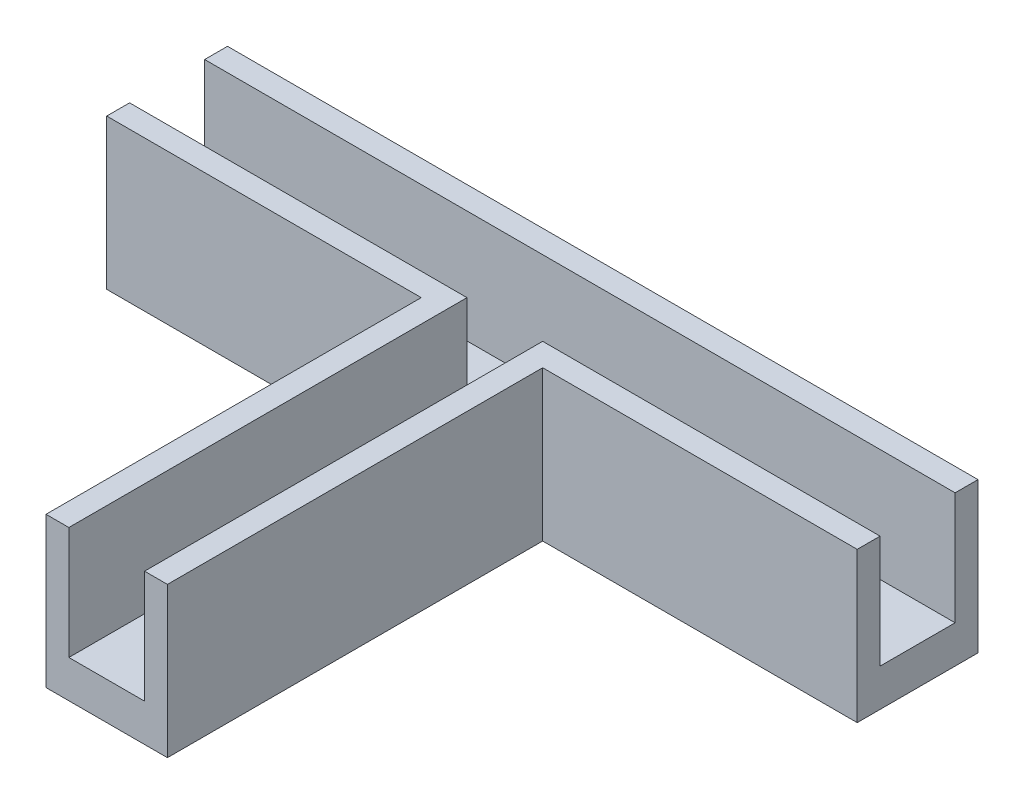
ISO-10303-21;
HEADER;
FILE_DESCRIPTION(('STEP AP214'),'2;1');
FILE_NAME('part.step','',(''),(''),'','','');
FILE_SCHEMA(('AUTOMOTIVE_DESIGN { 1 0 10303 214 1 1 1 1 }'));
ENDSEC;
DATA;
#1=APPLICATION_CONTEXT('core data for automotive mechanical design processes');
#2=APPLICATION_PROTOCOL_DEFINITION('international standard','automotive_design',2000,#1);
#3=PRODUCT_CONTEXT('',#1,'mechanical');
#4=PRODUCT('Part','Part','',(#3));
#5=PRODUCT_RELATED_PRODUCT_CATEGORY('part','',(#4));
#6=PRODUCT_DEFINITION_FORMATION('','',#4);
#7=PRODUCT_DEFINITION_CONTEXT('part definition',#1,'design');
#8=PRODUCT_DEFINITION('design','',#6,#7);
#9=PRODUCT_DEFINITION_SHAPE('','',#8);
#10=(LENGTH_UNIT() NAMED_UNIT(*) SI_UNIT(.MILLI.,.METRE.));
#11=(NAMED_UNIT(*) PLANE_ANGLE_UNIT() SI_UNIT($,.RADIAN.));
#12=(NAMED_UNIT(*) SI_UNIT($,.STERADIAN.) SOLID_ANGLE_UNIT());
#13=UNCERTAINTY_MEASURE_WITH_UNIT(LENGTH_MEASURE(1.E-05),#10,'distance_accuracy_value','');
#14=(GEOMETRIC_REPRESENTATION_CONTEXT(3) GLOBAL_UNCERTAINTY_ASSIGNED_CONTEXT((#13)) GLOBAL_UNIT_ASSIGNED_CONTEXT((#10,
#11,#12)) REPRESENTATION_CONTEXT('',''));
#15=CARTESIAN_POINT('',(0.,0.,0.));
#16=DIRECTION('',(0.,0.,1.));
#17=DIRECTION('',(1.,0.,0.));
#18=AXIS2_PLACEMENT_3D('',#15,#16,#17);
#19=CARTESIAN_POINT('',(0.,2.5,29.023999953));
#20=DIRECTION('',(0.,0.,-1.));
#21=DIRECTION('',(-1.,0.,0.));
#22=AXIS2_PLACEMENT_3D('',#19,#20,#21);
#23=PLANE('',#22);
#24=DIRECTION('',(1.,0.,0.));
#25=VECTOR('',#24,1.);
#26=CARTESIAN_POINT('',(0.,0.,29.023999953));
#27=LINE('',#26,#25);
#28=CARTESIAN_POINT('',(-4.04500000000002,0.,29.023999953));
#29=VERTEX_POINT('',#28);
#30=CARTESIAN_POINT('',(4.04499999999998,0.,29.023999953));
#31=VERTEX_POINT('',#30);
#32=EDGE_CURVE('E50',#29,#31,#27,.T.);
#33=ORIENTED_EDGE('',*,*,#32,.T.);
#34=DIRECTION('',(0.,-1.,0.));
#35=VECTOR('',#34,1.);
#36=CARTESIAN_POINT('',(4.04499999999998,10.,29.023999953));
#37=LINE('',#36,#35);
#38=CARTESIAN_POINT('',(4.04499999999998,10.,29.023999953));
#39=VERTEX_POINT('',#38);
#40=EDGE_CURVE('E261',#39,#31,#37,.T.);
#41=ORIENTED_EDGE('',*,*,#40,.F.);
#42=DIRECTION('',(1.,0.,0.));
#43=VECTOR('',#42,1.);
#44=CARTESIAN_POINT('',(0.,10.,29.023999953));
#45=LINE('',#44,#43);
#46=CARTESIAN_POINT('',(2.52099999999998,10.,29.023999953));
#47=VERTEX_POINT('',#46);
#48=EDGE_CURVE('E230',#47,#39,#45,.T.);
#49=ORIENTED_EDGE('',*,*,#48,.F.);
#50=DIRECTION('',(0.,-1.,0.));
#51=VECTOR('',#50,1.);
#52=CARTESIAN_POINT('',(2.52099999999998,10.,29.023999953));
#53=LINE('',#52,#51);
#54=CARTESIAN_POINT('',(2.52099999999998,2.5,29.023999953));
#55=VERTEX_POINT('',#54);
#56=EDGE_CURVE('E265',#47,#55,#53,.T.);
#57=ORIENTED_EDGE('',*,*,#56,.T.);
#58=DIRECTION('',(1.,0.,0.));
#59=VECTOR('',#58,1.);
#60=CARTESIAN_POINT('',(0.,2.5,29.023999953));
#61=LINE('',#60,#59);
#62=CARTESIAN_POINT('',(-2.52100000000002,2.5,29.023999953));
#63=VERTEX_POINT('',#62);
#64=EDGE_CURVE('E56',#63,#55,#61,.T.);
#65=ORIENTED_EDGE('',*,*,#64,.F.);
#66=DIRECTION('',(0.,-1.,0.));
#67=VECTOR('',#66,1.);
#68=CARTESIAN_POINT('',(-2.52100000000002,10.,29.023999953));
#69=LINE('',#68,#67);
#70=CARTESIAN_POINT('',(-2.52100000000002,10.,29.023999953));
#71=VERTEX_POINT('',#70);
#72=EDGE_CURVE('E199',#71,#63,#69,.T.);
#73=ORIENTED_EDGE('',*,*,#72,.F.);
#74=DIRECTION('',(-1.,0.,0.));
#75=VECTOR('',#74,1.);
#76=CARTESIAN_POINT('',(0.,10.,29.023999953));
#77=LINE('',#76,#75);
#78=CARTESIAN_POINT('',(-4.04500000000002,10.,29.023999953));
#79=VERTEX_POINT('',#78);
#80=EDGE_CURVE('E178',#71,#79,#77,.T.);
#81=ORIENTED_EDGE('',*,*,#80,.T.);
#82=DIRECTION('',(0.,-1.,0.));
#83=VECTOR('',#82,1.);
#84=CARTESIAN_POINT('',(-4.04500000000002,10.,29.023999953));
#85=LINE('',#84,#83);
#86=EDGE_CURVE('E208',#79,#29,#85,.T.);
#87=ORIENTED_EDGE('',*,*,#86,.T.);
#88=EDGE_LOOP('',(#33,#41,#49,#57,#65,#73,#81,#87));
#89=FACE_BOUND('',#88,.T.);
#90=ADVANCED_FACE('F47',(#89),#23,.F.);
#91=CARTESIAN_POINT('',(0.,2.5,0.));
#92=DIRECTION('',(0.,1.,0.));
#93=DIRECTION('',(0.,0.,1.));
#94=AXIS2_PLACEMENT_3D('',#91,#92,#93);
#95=PLANE('',#94);
#96=DIRECTION('',(0.,0.,1.));
#97=VECTOR('',#96,1.);
#98=CARTESIAN_POINT('',(-2.52100000000002,2.5,0.));
#99=LINE('',#98,#97);
#100=CARTESIAN_POINT('',(-2.52100000000002,2.5,2.499999953));
#101=VERTEX_POINT('',#100);
#102=EDGE_CURVE('E166',#101,#63,#99,.T.);
#103=ORIENTED_EDGE('',*,*,#102,.T.);
#104=ORIENTED_EDGE('',*,*,#64,.T.);
#105=DIRECTION('',(0.,0.,1.));
#106=VECTOR('',#105,1.);
#107=CARTESIAN_POINT('',(2.52099999999999,2.5,0.));
#108=LINE('',#107,#106);
#109=CARTESIAN_POINT('',(2.52099999999999,2.5,2.499999953));
#110=VERTEX_POINT('',#109);
#111=EDGE_CURVE('E11',#110,#55,#108,.T.);
#112=ORIENTED_EDGE('',*,*,#111,.F.);
#113=DIRECTION('',(1.,0.,0.));
#114=VECTOR('',#113,1.);
#115=CARTESIAN_POINT('',(0.,2.5,2.499999953));
#116=LINE('',#115,#114);
#117=CARTESIAN_POINT('',(25.,2.5,2.499999953));
#118=VERTEX_POINT('',#117);
#119=EDGE_CURVE('E320',#110,#118,#116,.T.);
#120=ORIENTED_EDGE('',*,*,#119,.T.);
#121=DIRECTION('',(0.,0.,1.));
#122=VECTOR('',#121,1.);
#123=CARTESIAN_POINT('',(25.,2.5,0.));
#124=LINE('',#123,#122);
#125=CARTESIAN_POINT('',(25.,2.5,-2.499999953));
#126=VERTEX_POINT('',#125);
#127=EDGE_CURVE('E308',#126,#118,#124,.T.);
#128=ORIENTED_EDGE('',*,*,#127,.F.);
#129=DIRECTION('',(1.,0.,0.));
#130=VECTOR('',#129,1.);
#131=CARTESIAN_POINT('',(0.,2.5,-2.499999953));
#132=LINE('',#131,#130);
#133=CARTESIAN_POINT('',(-25.,2.5,-2.499999953));
#134=VERTEX_POINT('',#133);
#135=EDGE_CURVE('E312',#134,#126,#132,.T.);
#136=ORIENTED_EDGE('',*,*,#135,.F.);
#137=DIRECTION('',(0.,0.,1.));
#138=VECTOR('',#137,1.);
#139=CARTESIAN_POINT('',(-25.,2.5,0.));
#140=LINE('',#139,#138);
#141=CARTESIAN_POINT('',(-25.,2.5,2.499999953));
#142=VERTEX_POINT('',#141);
#143=EDGE_CURVE('E317',#134,#142,#140,.T.);
#144=ORIENTED_EDGE('',*,*,#143,.T.);
#145=EDGE_CURVE('E63',#142,#101,#116,.T.);
#146=ORIENTED_EDGE('',*,*,#145,.T.);
#147=EDGE_LOOP('',(#103,#104,#112,#120,#128,#136,#144,#146));
#148=FACE_BOUND('',#147,.T.);
#149=ADVANCED_FACE('F331',(#148),#95,.T.);
#150=CARTESIAN_POINT('',(0.,0.,0.));
#151=DIRECTION('',(0.,1.,0.));
#152=DIRECTION('',(0.,0.,1.));
#153=AXIS2_PLACEMENT_3D('',#150,#151,#152);
#154=PLANE('',#153);
#155=ORIENTED_EDGE('',*,*,#32,.F.);
#156=DIRECTION('',(0.,0.,1.));
#157=VECTOR('',#156,1.);
#158=CARTESIAN_POINT('',(-4.04500000000002,0.,0.));
#159=LINE('',#158,#157);
#160=CARTESIAN_POINT('',(-4.04500000000002,0.,4.02399995300001));
#161=VERTEX_POINT('',#160);
#162=EDGE_CURVE('E180',#161,#29,#159,.T.);
#163=ORIENTED_EDGE('',*,*,#162,.F.);
#164=DIRECTION('',(1.,0.,0.));
#165=VECTOR('',#164,1.);
#166=CARTESIAN_POINT('',(0.,0.,4.02399995300001));
#167=LINE('',#166,#165);
#168=CARTESIAN_POINT('',(-25.,0.,4.02399995300001));
#169=VERTEX_POINT('',#168);
#170=EDGE_CURVE('E200',#169,#161,#167,.T.);
#171=ORIENTED_EDGE('',*,*,#170,.F.);
#172=DIRECTION('',(0.,0.,1.));
#173=VECTOR('',#172,1.);
#174=CARTESIAN_POINT('',(-25.,0.,0.));
#175=LINE('',#174,#173);
#176=CARTESIAN_POINT('',(-25.,0.,-4.023999953));
#177=VERTEX_POINT('',#176);
#178=EDGE_CURVE('E313',#177,#169,#175,.T.);
#179=ORIENTED_EDGE('',*,*,#178,.F.);
#180=DIRECTION('',(1.,0.,0.));
#181=VECTOR('',#180,1.);
#182=CARTESIAN_POINT('',(0.,0.,-4.023999953));
#183=LINE('',#182,#181);
#184=CARTESIAN_POINT('',(25.,0.,-4.023999953));
#185=VERTEX_POINT('',#184);
#186=EDGE_CURVE('E272',#177,#185,#183,.T.);
#187=ORIENTED_EDGE('',*,*,#186,.T.);
#188=DIRECTION('',(0.,0.,1.));
#189=VECTOR('',#188,1.);
#190=CARTESIAN_POINT('',(25.,0.,0.));
#191=LINE('',#190,#189);
#192=CARTESIAN_POINT('',(25.,0.,4.023999953));
#193=VERTEX_POINT('',#192);
#194=EDGE_CURVE('E307',#185,#193,#191,.T.);
#195=ORIENTED_EDGE('',*,*,#194,.T.);
#196=DIRECTION('',(-1.,0.,0.));
#197=VECTOR('',#196,1.);
#198=CARTESIAN_POINT('',(0.,0.,4.02399995300001));
#199=LINE('',#198,#197);
#200=CARTESIAN_POINT('',(4.04499999999998,0.,4.02399995300001));
#201=VERTEX_POINT('',#200);
#202=EDGE_CURVE('E227',#193,#201,#199,.T.);
#203=ORIENTED_EDGE('',*,*,#202,.T.);
#204=DIRECTION('',(0.,0.,1.));
#205=VECTOR('',#204,1.);
#206=CARTESIAN_POINT('',(4.04499999999998,0.,0.));
#207=LINE('',#206,#205);
#208=EDGE_CURVE('E170',#201,#31,#207,.T.);
#209=ORIENTED_EDGE('',*,*,#208,.T.);
#210=EDGE_LOOP('',(#155,#163,#171,#179,#187,#195,#203,#209));
#211=FACE_BOUND('',#210,.T.);
#212=ADVANCED_FACE('F342',(#211),#154,.F.);
#213=CARTESIAN_POINT('',(25.,2.5,0.));
#214=DIRECTION('',(1.,0.,0.));
#215=DIRECTION('',(0.,0.,-1.));
#216=AXIS2_PLACEMENT_3D('',#213,#214,#215);
#217=PLANE('',#216);
#218=ORIENTED_EDGE('',*,*,#194,.F.);
#219=DIRECTION('',(0.,-1.,0.));
#220=VECTOR('',#219,1.);
#221=CARTESIAN_POINT('',(25.,10.,-4.023999953));
#222=LINE('',#221,#220);
#223=CARTESIAN_POINT('',(25.,10.,-4.023999953));
#224=VERTEX_POINT('',#223);
#225=EDGE_CURVE('E299',#224,#185,#222,.T.);
#226=ORIENTED_EDGE('',*,*,#225,.F.);
#227=DIRECTION('',(0.,0.,-1.));
#228=VECTOR('',#227,1.);
#229=CARTESIAN_POINT('',(25.,10.,-1.13826999736011E-13));
#230=LINE('',#229,#228);
#231=CARTESIAN_POINT('',(25.,10.,-2.499999953));
#232=VERTEX_POINT('',#231);
#233=EDGE_CURVE('E277',#232,#224,#230,.T.);
#234=ORIENTED_EDGE('',*,*,#233,.F.);
#235=DIRECTION('',(0.,-1.,0.));
#236=VECTOR('',#235,1.);
#237=CARTESIAN_POINT('',(25.,10.,-2.499999953));
#238=LINE('',#237,#236);
#239=EDGE_CURVE('E303',#232,#126,#238,.T.);
#240=ORIENTED_EDGE('',*,*,#239,.T.);
#241=ORIENTED_EDGE('',*,*,#127,.T.);
#242=DIRECTION('',(0.,-1.,0.));
#243=VECTOR('',#242,1.);
#244=CARTESIAN_POINT('',(25.,10.,2.499999953));
#245=LINE('',#244,#243);
#246=CARTESIAN_POINT('',(25.,10.,2.499999953));
#247=VERTEX_POINT('',#246);
#248=EDGE_CURVE('E245',#247,#118,#245,.T.);
#249=ORIENTED_EDGE('',*,*,#248,.F.);
#250=DIRECTION('',(0.,0.,1.));
#251=VECTOR('',#250,1.);
#252=CARTESIAN_POINT('',(25.,10.,1.13826999736011E-13));
#253=LINE('',#252,#251);
#254=CARTESIAN_POINT('',(25.,10.,4.023999953));
#255=VERTEX_POINT('',#254);
#256=EDGE_CURVE('E241',#247,#255,#253,.T.);
#257=ORIENTED_EDGE('',*,*,#256,.T.);
#258=DIRECTION('',(0.,-1.,0.));
#259=VECTOR('',#258,1.);
#260=CARTESIAN_POINT('',(25.,10.,4.023999953));
#261=LINE('',#260,#259);
#262=EDGE_CURVE('E254',#255,#193,#261,.T.);
#263=ORIENTED_EDGE('',*,*,#262,.T.);
#264=EDGE_LOOP('',(#218,#226,#234,#240,#241,#249,#257,#263));
#265=FACE_BOUND('',#264,.T.);
#266=ADVANCED_FACE('F349',(#265),#217,.T.);
#267=CARTESIAN_POINT('',(-25.,2.5,0.));
#268=DIRECTION('',(1.,0.,0.));
#269=DIRECTION('',(0.,0.,-1.));
#270=AXIS2_PLACEMENT_3D('',#267,#268,#269);
#271=PLANE('',#270);
#272=ORIENTED_EDGE('',*,*,#178,.T.);
#273=DIRECTION('',(0.,-1.,0.));
#274=VECTOR('',#273,1.);
#275=CARTESIAN_POINT('',(-25.,10.,4.02399995300001));
#276=LINE('',#275,#274);
#277=CARTESIAN_POINT('',(-25.,10.,4.02399995300001));
#278=VERTEX_POINT('',#277);
#279=EDGE_CURVE('E216',#278,#169,#276,.T.);
#280=ORIENTED_EDGE('',*,*,#279,.F.);
#281=DIRECTION('',(0.,0.,1.));
#282=VECTOR('',#281,1.);
#283=CARTESIAN_POINT('',(-25.,10.,-1.13826999736011E-13));
#284=LINE('',#283,#282);
#285=CARTESIAN_POINT('',(-25.,10.,2.499999953));
#286=VERTEX_POINT('',#285);
#287=EDGE_CURVE('E186',#286,#278,#284,.T.);
#288=ORIENTED_EDGE('',*,*,#287,.F.);
#289=DIRECTION('',(0.,-1.,0.));
#290=VECTOR('',#289,1.);
#291=CARTESIAN_POINT('',(-25.,10.,2.499999953));
#292=LINE('',#291,#290);
#293=EDGE_CURVE('E171',#286,#142,#292,.T.);
#294=ORIENTED_EDGE('',*,*,#293,.T.);
#295=ORIENTED_EDGE('',*,*,#143,.F.);
#296=DIRECTION('',(0.,-1.,0.));
#297=VECTOR('',#296,1.);
#298=CARTESIAN_POINT('',(-25.,10.,-2.499999953));
#299=LINE('',#298,#297);
#300=CARTESIAN_POINT('',(-25.,10.,-2.499999953));
#301=VERTEX_POINT('',#300);
#302=EDGE_CURVE('E288',#301,#134,#299,.T.);
#303=ORIENTED_EDGE('',*,*,#302,.F.);
#304=DIRECTION('',(0.,0.,-1.));
#305=VECTOR('',#304,1.);
#306=CARTESIAN_POINT('',(-25.,10.,1.13826999736011E-13));
#307=LINE('',#306,#305);
#308=CARTESIAN_POINT('',(-25.,10.,-4.023999953));
#309=VERTEX_POINT('',#308);
#310=EDGE_CURVE('E284',#301,#309,#307,.T.);
#311=ORIENTED_EDGE('',*,*,#310,.T.);
#312=DIRECTION('',(0.,-1.,0.));
#313=VECTOR('',#312,1.);
#314=CARTESIAN_POINT('',(-25.,10.,-4.023999953));
#315=LINE('',#314,#313);
#316=EDGE_CURVE('E295',#309,#177,#315,.T.);
#317=ORIENTED_EDGE('',*,*,#316,.T.);
#318=EDGE_LOOP('',(#272,#280,#288,#294,#295,#303,#311,#317));
#319=FACE_BOUND('',#318,.T.);
#320=ADVANCED_FACE('F357',(#319),#271,.F.);
#321=CARTESIAN_POINT('',(0.,10.,-2.499999953));
#322=DIRECTION('',(0.,0.,-1.));
#323=DIRECTION('',(-1.,0.,0.));
#324=AXIS2_PLACEMENT_3D('',#321,#322,#323);
#325=PLANE('',#324);
#326=ORIENTED_EDGE('',*,*,#302,.T.);
#327=ORIENTED_EDGE('',*,*,#135,.T.);
#328=ORIENTED_EDGE('',*,*,#239,.F.);
#329=DIRECTION('',(1.,0.,0.));
#330=VECTOR('',#329,1.);
#331=CARTESIAN_POINT('',(0.,10.,-2.499999953));
#332=LINE('',#331,#330);
#333=EDGE_CURVE('E273',#301,#232,#332,.T.);
#334=ORIENTED_EDGE('',*,*,#333,.F.);
#335=EDGE_LOOP('',(#326,#327,#328,#334));
#336=FACE_BOUND('',#335,.T.);
#337=ADVANCED_FACE('F354',(#336),#325,.F.);
#338=CARTESIAN_POINT('',(0.,10.,-4.023999953));
#339=DIRECTION('',(0.,0.,-1.));
#340=DIRECTION('',(-1.,0.,0.));
#341=AXIS2_PLACEMENT_3D('',#338,#339,#340);
#342=PLANE('',#341);
#343=ORIENTED_EDGE('',*,*,#186,.F.);
#344=ORIENTED_EDGE('',*,*,#316,.F.);
#345=DIRECTION('',(1.,0.,0.));
#346=VECTOR('',#345,1.);
#347=CARTESIAN_POINT('',(0.,10.,-4.023999953));
#348=LINE('',#347,#346);
#349=EDGE_CURVE('E280',#309,#224,#348,.T.);
#350=ORIENTED_EDGE('',*,*,#349,.T.);
#351=ORIENTED_EDGE('',*,*,#225,.T.);
#352=EDGE_LOOP('',(#343,#344,#350,#351));
#353=FACE_BOUND('',#352,.T.);
#354=ADVANCED_FACE('F385',(#353),#342,.T.);
#355=CARTESIAN_POINT('',(0.,10.,0.));
#356=DIRECTION('',(0.,1.,0.));
#357=DIRECTION('',(0.,0.,1.));
#358=AXIS2_PLACEMENT_3D('',#355,#356,#357);
#359=PLANE('',#358);
#360=ORIENTED_EDGE('',*,*,#333,.T.);
#361=ORIENTED_EDGE('',*,*,#233,.T.);
#362=ORIENTED_EDGE('',*,*,#349,.F.);
#363=ORIENTED_EDGE('',*,*,#310,.F.);
#364=EDGE_LOOP('',(#360,#361,#362,#363));
#365=FACE_BOUND('',#364,.T.);
#366=ADVANCED_FACE('F388',(#365),#359,.T.);
#367=CARTESIAN_POINT('',(0.,10.,2.499999953));
#368=DIRECTION('',(0.,0.,-1.));
#369=DIRECTION('',(-1.,0.,0.));
#370=AXIS2_PLACEMENT_3D('',#367,#368,#369);
#371=PLANE('',#370);
#372=ORIENTED_EDGE('',*,*,#248,.T.);
#373=ORIENTED_EDGE('',*,*,#119,.F.);
#374=DIRECTION('',(0.,-1.,0.));
#375=VECTOR('',#374,1.);
#376=CARTESIAN_POINT('',(2.52099999999999,10.,2.499999953));
#377=LINE('',#376,#375);
#378=CARTESIAN_POINT('',(2.52099999999999,10.,2.499999953));
#379=VERTEX_POINT('',#378);
#380=EDGE_CURVE('E268',#379,#110,#377,.T.);
#381=ORIENTED_EDGE('',*,*,#380,.F.);
#382=DIRECTION('',(1.,0.,0.));
#383=VECTOR('',#382,1.);
#384=CARTESIAN_POINT('',(0.,10.,2.499999953));
#385=LINE('',#384,#383);
#386=EDGE_CURVE('E222',#379,#247,#385,.T.);
#387=ORIENTED_EDGE('',*,*,#386,.T.);
#388=EDGE_LOOP('',(#372,#373,#381,#387));
#389=FACE_BOUND('',#388,.T.);
#390=ADVANCED_FACE('F392',(#389),#371,.T.);
#391=CARTESIAN_POINT('',(2.52099999999999,10.,0.));
#392=DIRECTION('',(1.,0.,0.));
#393=DIRECTION('',(0.,0.,-1.));
#394=AXIS2_PLACEMENT_3D('',#391,#392,#393);
#395=PLANE('',#394);
#396=ORIENTED_EDGE('',*,*,#111,.T.);
#397=ORIENTED_EDGE('',*,*,#56,.F.);
#398=DIRECTION('',(0.,0.,1.));
#399=VECTOR('',#398,1.);
#400=CARTESIAN_POINT('',(2.52099999999999,10.,0.));
#401=LINE('',#400,#399);
#402=EDGE_CURVE('E226',#379,#47,#401,.T.);
#403=ORIENTED_EDGE('',*,*,#402,.F.);
#404=ORIENTED_EDGE('',*,*,#380,.T.);
#405=EDGE_LOOP('',(#396,#397,#403,#404));
#406=FACE_BOUND('',#405,.T.);
#407=ADVANCED_FACE('F396',(#406),#395,.F.);
#408=CARTESIAN_POINT('',(4.04499999999998,10.,0.));
#409=DIRECTION('',(1.,0.,0.));
#410=DIRECTION('',(0.,0.,-1.));
#411=AXIS2_PLACEMENT_3D('',#408,#409,#410);
#412=PLANE('',#411);
#413=ORIENTED_EDGE('',*,*,#208,.F.);
#414=DIRECTION('',(0.,-1.,0.));
#415=VECTOR('',#414,1.);
#416=CARTESIAN_POINT('',(4.04499999999998,10.,4.02399995300001));
#417=LINE('',#416,#415);
#418=CARTESIAN_POINT('',(4.04499999999998,10.,4.02399995300001));
#419=VERTEX_POINT('',#418);
#420=EDGE_CURVE('E258',#419,#201,#417,.T.);
#421=ORIENTED_EDGE('',*,*,#420,.F.);
#422=DIRECTION('',(0.,0.,1.));
#423=VECTOR('',#422,1.);
#424=CARTESIAN_POINT('',(4.04499999999998,10.,0.));
#425=LINE('',#424,#423);
#426=EDGE_CURVE('E233',#419,#39,#425,.T.);
#427=ORIENTED_EDGE('',*,*,#426,.T.);
#428=ORIENTED_EDGE('',*,*,#40,.T.);
#429=EDGE_LOOP('',(#413,#421,#427,#428));
#430=FACE_BOUND('',#429,.T.);
#431=ADVANCED_FACE('F399',(#430),#412,.T.);
#432=CARTESIAN_POINT('',(0.,10.,4.02399995300001));
#433=DIRECTION('',(0.,0.,1.));
#434=DIRECTION('',(1.,0.,0.));
#435=AXIS2_PLACEMENT_3D('',#432,#433,#434);
#436=PLANE('',#435);
#437=ORIENTED_EDGE('',*,*,#202,.F.);
#438=ORIENTED_EDGE('',*,*,#262,.F.);
#439=DIRECTION('',(-1.,0.,0.));
#440=VECTOR('',#439,1.);
#441=CARTESIAN_POINT('',(0.,10.,4.02399995300001));
#442=LINE('',#441,#440);
#443=EDGE_CURVE('E237',#255,#419,#442,.T.);
#444=ORIENTED_EDGE('',*,*,#443,.T.);
#445=ORIENTED_EDGE('',*,*,#420,.T.);
#446=EDGE_LOOP('',(#437,#438,#444,#445));
#447=FACE_BOUND('',#446,.T.);
#448=ADVANCED_FACE('F403',(#447),#436,.T.);
#449=CARTESIAN_POINT('',(0.,10.,0.));
#450=DIRECTION('',(0.,1.,0.));
#451=DIRECTION('',(0.,0.,1.));
#452=AXIS2_PLACEMENT_3D('',#449,#450,#451);
#453=PLANE('',#452);
#454=ORIENTED_EDGE('',*,*,#386,.F.);
#455=ORIENTED_EDGE('',*,*,#402,.T.);
#456=ORIENTED_EDGE('',*,*,#48,.T.);
#457=ORIENTED_EDGE('',*,*,#426,.F.);
#458=ORIENTED_EDGE('',*,*,#443,.F.);
#459=ORIENTED_EDGE('',*,*,#256,.F.);
#460=EDGE_LOOP('',(#454,#455,#456,#457,#458,#459));
#461=FACE_BOUND('',#460,.T.);
#462=ADVANCED_FACE('F407',(#461),#453,.T.);
#463=CARTESIAN_POINT('',(-2.52100000000002,10.,0.));
#464=DIRECTION('',(1.,0.,0.));
#465=DIRECTION('',(0.,0.,-1.));
#466=AXIS2_PLACEMENT_3D('',#463,#464,#465);
#467=PLANE('',#466);
#468=ORIENTED_EDGE('',*,*,#72,.T.);
#469=ORIENTED_EDGE('',*,*,#102,.F.);
#470=DIRECTION('',(0.,-1.,0.));
#471=VECTOR('',#470,1.);
#472=CARTESIAN_POINT('',(-2.52100000000002,10.,2.499999953));
#473=LINE('',#472,#471);
#474=CARTESIAN_POINT('',(-2.52100000000002,10.,2.499999953));
#475=VERTEX_POINT('',#474);
#476=EDGE_CURVE('E160',#475,#101,#473,.T.);
#477=ORIENTED_EDGE('',*,*,#476,.F.);
#478=DIRECTION('',(0.,0.,1.));
#479=VECTOR('',#478,1.);
#480=CARTESIAN_POINT('',(-2.52100000000002,10.,0.));
#481=LINE('',#480,#479);
#482=EDGE_CURVE('E164',#475,#71,#481,.T.);
#483=ORIENTED_EDGE('',*,*,#482,.T.);
#484=EDGE_LOOP('',(#468,#469,#477,#483));
#485=FACE_BOUND('',#484,.T.);
#486=ADVANCED_FACE('F163',(#485),#467,.T.);
#487=CARTESIAN_POINT('',(0.,10.,2.499999953));
#488=DIRECTION('',(0.,0.,-1.));
#489=DIRECTION('',(-1.,0.,0.));
#490=AXIS2_PLACEMENT_3D('',#487,#488,#489);
#491=PLANE('',#490);
#492=ORIENTED_EDGE('',*,*,#476,.T.);
#493=ORIENTED_EDGE('',*,*,#145,.F.);
#494=ORIENTED_EDGE('',*,*,#293,.F.);
#495=DIRECTION('',(1.,0.,0.));
#496=VECTOR('',#495,1.);
#497=CARTESIAN_POINT('',(0.,10.,2.499999953));
#498=LINE('',#497,#496);
#499=EDGE_CURVE('E176',#286,#475,#498,.T.);
#500=ORIENTED_EDGE('',*,*,#499,.T.);
#501=EDGE_LOOP('',(#492,#493,#494,#500));
#502=FACE_BOUND('',#501,.T.);
#503=ADVANCED_FACE('F182',(#502),#491,.T.);
#504=CARTESIAN_POINT('',(0.,10.,4.02399995300001));
#505=DIRECTION('',(0.,0.,-1.));
#506=DIRECTION('',(-1.,0.,0.));
#507=AXIS2_PLACEMENT_3D('',#504,#505,#506);
#508=PLANE('',#507);
#509=ORIENTED_EDGE('',*,*,#170,.T.);
#510=DIRECTION('',(0.,-1.,0.));
#511=VECTOR('',#510,1.);
#512=CARTESIAN_POINT('',(-4.04500000000002,10.,4.02399995300001));
#513=LINE('',#512,#511);
#514=CARTESIAN_POINT('',(-4.04500000000002,10.,4.02399995300001));
#515=VERTEX_POINT('',#514);
#516=EDGE_CURVE('E212',#515,#161,#513,.T.);
#517=ORIENTED_EDGE('',*,*,#516,.F.);
#518=DIRECTION('',(1.,0.,0.));
#519=VECTOR('',#518,1.);
#520=CARTESIAN_POINT('',(0.,10.,4.02399995300001));
#521=LINE('',#520,#519);
#522=EDGE_CURVE('E189',#278,#515,#521,.T.);
#523=ORIENTED_EDGE('',*,*,#522,.F.);
#524=ORIENTED_EDGE('',*,*,#279,.T.);
#525=EDGE_LOOP('',(#509,#517,#523,#524));
#526=FACE_BOUND('',#525,.T.);
#527=ADVANCED_FACE('F361',(#526),#508,.F.);
#528=CARTESIAN_POINT('',(-4.04500000000002,10.,0.));
#529=DIRECTION('',(1.,0.,0.));
#530=DIRECTION('',(0.,0.,-1.));
#531=AXIS2_PLACEMENT_3D('',#528,#529,#530);
#532=PLANE('',#531);
#533=ORIENTED_EDGE('',*,*,#162,.T.);
#534=ORIENTED_EDGE('',*,*,#86,.F.);
#535=DIRECTION('',(0.,0.,1.));
#536=VECTOR('',#535,1.);
#537=CARTESIAN_POINT('',(-4.04500000000002,10.,0.));
#538=LINE('',#537,#536);
#539=EDGE_CURVE('E194',#515,#79,#538,.T.);
#540=ORIENTED_EDGE('',*,*,#539,.F.);
#541=ORIENTED_EDGE('',*,*,#516,.T.);
#542=EDGE_LOOP('',(#533,#534,#540,#541));
#543=FACE_BOUND('',#542,.T.);
#544=ADVANCED_FACE('F338',(#543),#532,.F.);
#545=CARTESIAN_POINT('',(0.,10.,0.));
#546=DIRECTION('',(0.,1.,0.));
#547=DIRECTION('',(0.,0.,1.));
#548=AXIS2_PLACEMENT_3D('',#545,#546,#547);
#549=PLANE('',#548);
#550=ORIENTED_EDGE('',*,*,#482,.F.);
#551=ORIENTED_EDGE('',*,*,#499,.F.);
#552=ORIENTED_EDGE('',*,*,#287,.T.);
#553=ORIENTED_EDGE('',*,*,#522,.T.);
#554=ORIENTED_EDGE('',*,*,#539,.T.);
#555=ORIENTED_EDGE('',*,*,#80,.F.);
#556=EDGE_LOOP('',(#550,#551,#552,#553,#554,#555));
#557=FACE_BOUND('',#556,.T.);
#558=ADVANCED_FACE('F175',(#557),#549,.T.);
#559=CLOSED_SHELL('',(#90,#149,#212,#266,#320,#337,#354,#366,#390,#407,#431,#448,#462,#486,#503,
#527,#544,#558));
#560=MANIFOLD_SOLID_BREP('B2',#559);
#561=ADVANCED_BREP_SHAPE_REPRESENTATION('',(#18,#560),#14);
#562=SHAPE_DEFINITION_REPRESENTATION(#9,#561);
ENDSEC;
END-ISO-10303-21;
